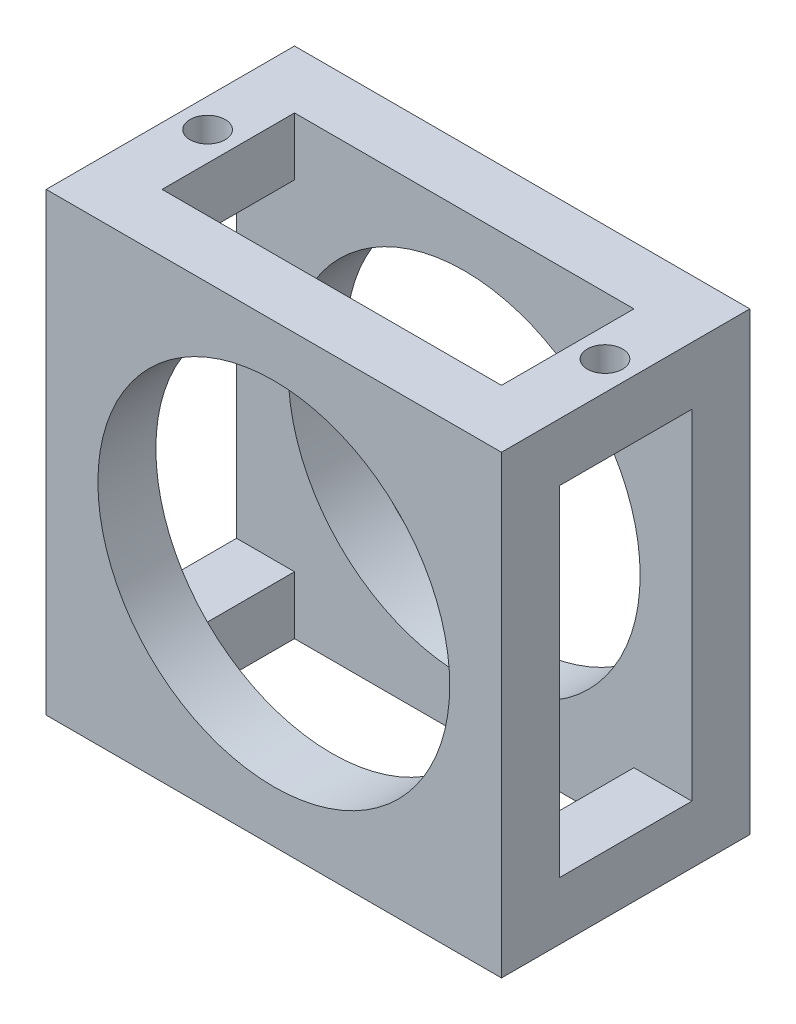
ISO-10303-21;
HEADER;
FILE_DESCRIPTION(('STEP AP214'),'2;1');
FILE_NAME('part.step','',(''),(''),'','','');
FILE_SCHEMA(('AUTOMOTIVE_DESIGN { 1 0 10303 214 1 1 1 1 }'));
ENDSEC;
DATA;
#1=APPLICATION_CONTEXT('core data for automotive mechanical design processes');
#2=APPLICATION_PROTOCOL_DEFINITION('international standard','automotive_design',2000,#1);
#3=PRODUCT_CONTEXT('',#1,'mechanical');
#4=PRODUCT('Part','Part','',(#3));
#5=PRODUCT_RELATED_PRODUCT_CATEGORY('part','',(#4));
#6=PRODUCT_DEFINITION_FORMATION('','',#4);
#7=PRODUCT_DEFINITION_CONTEXT('part definition',#1,'design');
#8=PRODUCT_DEFINITION('design','',#6,#7);
#9=PRODUCT_DEFINITION_SHAPE('','',#8);
#10=(LENGTH_UNIT() NAMED_UNIT(*) SI_UNIT(.MILLI.,.METRE.));
#11=(NAMED_UNIT(*) PLANE_ANGLE_UNIT() SI_UNIT($,.RADIAN.));
#12=(NAMED_UNIT(*) SI_UNIT($,.STERADIAN.) SOLID_ANGLE_UNIT());
#13=UNCERTAINTY_MEASURE_WITH_UNIT(LENGTH_MEASURE(1.E-05),#10,'distance_accuracy_value','');
#14=(GEOMETRIC_REPRESENTATION_CONTEXT(3) GLOBAL_UNCERTAINTY_ASSIGNED_CONTEXT((#13)) GLOBAL_UNIT_ASSIGNED_CONTEXT((#10,
#11,#12)) REPRESENTATION_CONTEXT('',''));
#15=CARTESIAN_POINT('',(0.,0.,0.));
#16=DIRECTION('',(0.,0.,1.));
#17=DIRECTION('',(1.,0.,0.));
#18=AXIS2_PLACEMENT_3D('',#15,#16,#17);
#19=CARTESIAN_POINT('',(0.,0.,0.));
#20=DIRECTION('',(0.,0.,1.));
#21=DIRECTION('',(1.,0.,0.));
#22=AXIS2_PLACEMENT_3D('',#19,#20,#21);
#23=CYLINDRICAL_SURFACE('',#22,21.25);
#24=CARTESIAN_POINT('',(0.,0.,30.));
#25=DIRECTION('',(0.,0.,1.));
#26=DIRECTION('',(1.,0.,0.));
#27=AXIS2_PLACEMENT_3D('',#24,#25,#26);
#28=CIRCLE('',#27,21.25);
#29=CARTESIAN_POINT('',(21.25,0.,30.));
#30=VERTEX_POINT('',#29);
#31=EDGE_CURVE('E278',#30,#30,#28,.T.);
#32=ORIENTED_EDGE('',*,*,#31,.T.);
#33=EDGE_LOOP('',(#32));
#34=FACE_BOUND('',#33,.T.);
#35=CARTESIAN_POINT('',(0.,0.,23.));
#36=DIRECTION('',(0.,0.,1.));
#37=DIRECTION('',(1.,0.,0.));
#38=AXIS2_PLACEMENT_3D('',#35,#36,#37);
#39=CIRCLE('',#38,21.25);
#40=CARTESIAN_POINT('',(21.25,0.,23.));
#41=VERTEX_POINT('',#40);
#42=EDGE_CURVE('E328',#41,#41,#39,.F.);
#43=ORIENTED_EDGE('',*,*,#42,.T.);
#44=EDGE_LOOP('',(#43));
#45=FACE_BOUND('',#44,.T.);
#46=ADVANCED_FACE('F45',(#34,#45),#23,.F.);
#47=CARTESIAN_POINT('',(-27.5,27.5,30.));
#48=DIRECTION('',(1.,0.,0.));
#49=DIRECTION('',(0.,1.,0.));
#50=AXIS2_PLACEMENT_3D('',#47,#48,#49);
#51=PLANE('',#50);
#52=DIRECTION('',(0.,0.,1.));
#53=VECTOR('',#52,1.);
#54=CARTESIAN_POINT('',(-27.5,20.5,30.));
#55=LINE('',#54,#53);
#56=CARTESIAN_POINT('',(-27.5,20.5,7.));
#57=VERTEX_POINT('',#56);
#58=CARTESIAN_POINT('',(-27.5,20.5,23.));
#59=VERTEX_POINT('',#58);
#60=EDGE_CURVE('E227',#57,#59,#55,.T.);
#61=ORIENTED_EDGE('',*,*,#60,.T.);
#62=DIRECTION('',(0.,-1.,0.));
#63=VECTOR('',#62,1.);
#64=CARTESIAN_POINT('',(-27.5,27.5,23.));
#65=LINE('',#64,#63);
#66=CARTESIAN_POINT('',(-27.5,-20.5,23.));
#67=VERTEX_POINT('',#66);
#68=EDGE_CURVE('E219',#59,#67,#65,.T.);
#69=ORIENTED_EDGE('',*,*,#68,.T.);
#70=DIRECTION('',(0.,0.,-1.));
#71=VECTOR('',#70,1.);
#72=CARTESIAN_POINT('',(-27.5,-20.5,30.));
#73=LINE('',#72,#71);
#74=CARTESIAN_POINT('',(-27.5,-20.5,7.));
#75=VERTEX_POINT('',#74);
#76=EDGE_CURVE('E211',#67,#75,#73,.T.);
#77=ORIENTED_EDGE('',*,*,#76,.T.);
#78=DIRECTION('',(0.,1.,0.));
#79=VECTOR('',#78,1.);
#80=CARTESIAN_POINT('',(-27.5,27.5,7.));
#81=LINE('',#80,#79);
#82=EDGE_CURVE('E215',#75,#57,#81,.T.);
#83=ORIENTED_EDGE('',*,*,#82,.T.);
#84=EDGE_LOOP('',(#61,#69,#77,#83));
#85=FACE_BOUND('',#84,.T.);
#86=DIRECTION('',(0.,-1.,0.));
#87=VECTOR('',#86,1.);
#88=CARTESIAN_POINT('',(-27.5,27.5,0.));
#89=LINE('',#88,#87);
#90=CARTESIAN_POINT('',(-27.5,27.5,0.));
#91=VERTEX_POINT('',#90);
#92=CARTESIAN_POINT('',(-27.5,-27.5,0.));
#93=VERTEX_POINT('',#92);
#94=EDGE_CURVE('E283',#91,#93,#89,.T.);
#95=ORIENTED_EDGE('',*,*,#94,.T.);
#96=DIRECTION('',(0.,0.,-1.));
#97=VECTOR('',#96,1.);
#98=CARTESIAN_POINT('',(-27.5,-27.5,30.));
#99=LINE('',#98,#97);
#100=CARTESIAN_POINT('',(-27.5,-27.5,30.));
#101=VERTEX_POINT('',#100);
#102=EDGE_CURVE('E324',#101,#93,#99,.T.);
#103=ORIENTED_EDGE('',*,*,#102,.F.);
#104=DIRECTION('',(0.,-1.,0.));
#105=VECTOR('',#104,1.);
#106=CARTESIAN_POINT('',(-27.5,27.5,30.));
#107=LINE('',#106,#105);
#108=CARTESIAN_POINT('',(-27.5,27.5,30.));
#109=VERTEX_POINT('',#108);
#110=EDGE_CURVE('E287',#109,#101,#107,.T.);
#111=ORIENTED_EDGE('',*,*,#110,.F.);
#112=DIRECTION('',(0.,0.,-1.));
#113=VECTOR('',#112,1.);
#114=CARTESIAN_POINT('',(-27.5,27.5,30.));
#115=LINE('',#114,#113);
#116=EDGE_CURVE('E301',#109,#91,#115,.T.);
#117=ORIENTED_EDGE('',*,*,#116,.T.);
#118=EDGE_LOOP('',(#95,#103,#111,#117));
#119=FACE_BOUND('',#118,.T.);
#120=ADVANCED_FACE('F47',(#85,#119),#51,.F.);
#121=CARTESIAN_POINT('',(-27.5,-27.5,30.));
#122=DIRECTION('',(0.,1.,0.));
#123=DIRECTION('',(0.,0.,1.));
#124=AXIS2_PLACEMENT_3D('',#121,#122,#123);
#125=PLANE('',#124);
#126=DIRECTION('',(-1.,0.,0.));
#127=VECTOR('',#126,1.);
#128=CARTESIAN_POINT('',(-27.5,-27.5,7.));
#129=LINE('',#128,#127);
#130=CARTESIAN_POINT('',(20.5,-27.5,7.));
#131=VERTEX_POINT('',#130);
#132=CARTESIAN_POINT('',(-20.5,-27.5,7.));
#133=VERTEX_POINT('',#132);
#134=EDGE_CURVE('E270',#131,#133,#129,.T.);
#135=ORIENTED_EDGE('',*,*,#134,.T.);
#136=DIRECTION('',(0.,0.,1.));
#137=VECTOR('',#136,1.);
#138=CARTESIAN_POINT('',(-20.5,-27.5,30.));
#139=LINE('',#138,#137);
#140=CARTESIAN_POINT('',(-20.5,-27.5,23.));
#141=VERTEX_POINT('',#140);
#142=EDGE_CURVE('E274',#133,#141,#139,.T.);
#143=ORIENTED_EDGE('',*,*,#142,.T.);
#144=DIRECTION('',(1.,0.,0.));
#145=VECTOR('',#144,1.);
#146=CARTESIAN_POINT('',(-27.5,-27.5,23.));
#147=LINE('',#146,#145);
#148=CARTESIAN_POINT('',(20.5,-27.5,23.));
#149=VERTEX_POINT('',#148);
#150=EDGE_CURVE('E262',#141,#149,#147,.T.);
#151=ORIENTED_EDGE('',*,*,#150,.T.);
#152=DIRECTION('',(0.,0.,-1.));
#153=VECTOR('',#152,1.);
#154=CARTESIAN_POINT('',(20.5,-27.5,30.));
#155=LINE('',#154,#153);
#156=EDGE_CURVE('E266',#149,#131,#155,.T.);
#157=ORIENTED_EDGE('',*,*,#156,.T.);
#158=EDGE_LOOP('',(#135,#143,#151,#157));
#159=FACE_BOUND('',#158,.T.);
#160=DIRECTION('',(1.,0.,0.));
#161=VECTOR('',#160,1.);
#162=CARTESIAN_POINT('',(-27.5,-27.5,0.));
#163=LINE('',#162,#161);
#164=CARTESIAN_POINT('',(27.5,-27.5,0.));
#165=VERTEX_POINT('',#164);
#166=EDGE_CURVE('E305',#93,#165,#163,.T.);
#167=ORIENTED_EDGE('',*,*,#166,.T.);
#168=DIRECTION('',(0.,0.,-1.));
#169=VECTOR('',#168,1.);
#170=CARTESIAN_POINT('',(27.5,-27.5,30.));
#171=LINE('',#170,#169);
#172=CARTESIAN_POINT('',(27.5,-27.5,30.));
#173=VERTEX_POINT('',#172);
#174=EDGE_CURVE('E320',#173,#165,#171,.T.);
#175=ORIENTED_EDGE('',*,*,#174,.F.);
#176=DIRECTION('',(1.,0.,0.));
#177=VECTOR('',#176,1.);
#178=CARTESIAN_POINT('',(-27.5,-27.5,30.));
#179=LINE('',#178,#177);
#180=EDGE_CURVE('E291',#101,#173,#179,.T.);
#181=ORIENTED_EDGE('',*,*,#180,.F.);
#182=ORIENTED_EDGE('',*,*,#102,.T.);
#183=EDGE_LOOP('',(#167,#175,#181,#182));
#184=FACE_BOUND('',#183,.T.);
#185=ADVANCED_FACE('F380',(#159,#184),#125,.F.);
#186=CARTESIAN_POINT('',(27.5,27.5,30.));
#187=DIRECTION('',(-1.,0.,0.));
#188=DIRECTION('',(0.,-1.,0.));
#189=AXIS2_PLACEMENT_3D('',#186,#187,#188);
#190=PLANE('',#189);
#191=DIRECTION('',(0.,0.,-1.));
#192=VECTOR('',#191,1.);
#193=CARTESIAN_POINT('',(27.5,-20.5,23.));
#194=LINE('',#193,#192);
#195=CARTESIAN_POINT('',(27.5,-20.5,23.));
#196=VERTEX_POINT('',#195);
#197=CARTESIAN_POINT('',(27.5,-20.5,6.99999999999999));
#198=VERTEX_POINT('',#197);
#199=EDGE_CURVE('E178',#196,#198,#194,.T.);
#200=ORIENTED_EDGE('',*,*,#199,.F.);
#201=DIRECTION('',(0.,-1.,0.));
#202=VECTOR('',#201,1.);
#203=CARTESIAN_POINT('',(27.5,20.5,23.));
#204=LINE('',#203,#202);
#205=CARTESIAN_POINT('',(27.5,20.5,23.));
#206=VERTEX_POINT('',#205);
#207=EDGE_CURVE('E71',#206,#196,#204,.T.);
#208=ORIENTED_EDGE('',*,*,#207,.F.);
#209=DIRECTION('',(0.,0.,1.));
#210=VECTOR('',#209,1.);
#211=CARTESIAN_POINT('',(27.5,20.5,23.));
#212=LINE('',#211,#210);
#213=CARTESIAN_POINT('',(27.5,20.5,7.));
#214=VERTEX_POINT('',#213);
#215=EDGE_CURVE('E187',#214,#206,#212,.T.);
#216=ORIENTED_EDGE('',*,*,#215,.F.);
#217=DIRECTION('',(0.,1.,0.));
#218=VECTOR('',#217,1.);
#219=CARTESIAN_POINT('',(27.5,20.5,7.));
#220=LINE('',#219,#218);
#221=EDGE_CURVE('E168',#198,#214,#220,.T.);
#222=ORIENTED_EDGE('',*,*,#221,.F.);
#223=EDGE_LOOP('',(#200,#208,#216,#222));
#224=FACE_BOUND('',#223,.T.);
#225=DIRECTION('',(0.,1.,0.));
#226=VECTOR('',#225,1.);
#227=CARTESIAN_POINT('',(27.5,27.5,0.));
#228=LINE('',#227,#226);
#229=CARTESIAN_POINT('',(27.5,27.5,0.));
#230=VERTEX_POINT('',#229);
#231=EDGE_CURVE('E308',#165,#230,#228,.T.);
#232=ORIENTED_EDGE('',*,*,#231,.T.);
#233=DIRECTION('',(0.,0.,-1.));
#234=VECTOR('',#233,1.);
#235=CARTESIAN_POINT('',(27.5,27.5,30.));
#236=LINE('',#235,#234);
#237=CARTESIAN_POINT('',(27.5,27.5,30.));
#238=VERTEX_POINT('',#237);
#239=EDGE_CURVE('E316',#238,#230,#236,.T.);
#240=ORIENTED_EDGE('',*,*,#239,.F.);
#241=DIRECTION('',(0.,1.,0.));
#242=VECTOR('',#241,1.);
#243=CARTESIAN_POINT('',(27.5,27.5,30.));
#244=LINE('',#243,#242);
#245=EDGE_CURVE('E295',#173,#238,#244,.T.);
#246=ORIENTED_EDGE('',*,*,#245,.F.);
#247=ORIENTED_EDGE('',*,*,#174,.T.);
#248=EDGE_LOOP('',(#232,#240,#246,#247));
#249=FACE_BOUND('',#248,.T.);
#250=ADVANCED_FACE('F184',(#224,#249),#190,.F.);
#251=CARTESIAN_POINT('',(-27.5,27.5,30.));
#252=DIRECTION('',(0.,-1.,0.));
#253=DIRECTION('',(0.,0.,-1.));
#254=AXIS2_PLACEMENT_3D('',#251,#252,#253);
#255=PLANE('',#254);
#256=CARTESIAN_POINT('',(-24.,27.5,14.));
#257=DIRECTION('',(0.,1.,0.));
#258=DIRECTION('',(0.,0.,1.));
#259=AXIS2_PLACEMENT_3D('',#256,#257,#258);
#260=CIRCLE('',#259,2.125);
#261=CARTESIAN_POINT('',(-24.,27.5,16.125));
#262=VERTEX_POINT('',#261);
#263=EDGE_CURVE('E337',#262,#262,#260,.T.);
#264=ORIENTED_EDGE('',*,*,#263,.F.);
#265=EDGE_LOOP('',(#264));
#266=FACE_BOUND('',#265,.T.);
#267=CARTESIAN_POINT('',(24.,27.5,14.));
#268=DIRECTION('',(0.,1.,0.));
#269=DIRECTION('',(0.,0.,1.));
#270=AXIS2_PLACEMENT_3D('',#267,#268,#269);
#271=CIRCLE('',#270,2.125);
#272=CARTESIAN_POINT('',(24.,27.5,16.125));
#273=VERTEX_POINT('',#272);
#274=EDGE_CURVE('E344',#273,#273,#271,.T.);
#275=ORIENTED_EDGE('',*,*,#274,.F.);
#276=EDGE_LOOP('',(#275));
#277=FACE_BOUND('',#276,.T.);
#278=DIRECTION('',(1.,0.,0.));
#279=VECTOR('',#278,1.);
#280=CARTESIAN_POINT('',(-20.5,27.5,23.));
#281=LINE('',#280,#279);
#282=CARTESIAN_POINT('',(-20.5,27.5,23.));
#283=VERTEX_POINT('',#282);
#284=CARTESIAN_POINT('',(20.5,27.5,23.));
#285=VERTEX_POINT('',#284);
#286=EDGE_CURVE('E235',#283,#285,#281,.T.);
#287=ORIENTED_EDGE('',*,*,#286,.F.);
#288=DIRECTION('',(0.,0.,1.));
#289=VECTOR('',#288,1.);
#290=CARTESIAN_POINT('',(-20.5,27.5,7.));
#291=LINE('',#290,#289);
#292=CARTESIAN_POINT('',(-20.5,27.5,7.));
#293=VERTEX_POINT('',#292);
#294=EDGE_CURVE('E231',#293,#283,#291,.T.);
#295=ORIENTED_EDGE('',*,*,#294,.F.);
#296=DIRECTION('',(-1.,0.,0.));
#297=VECTOR('',#296,1.);
#298=CARTESIAN_POINT('',(-20.5,27.5,7.));
#299=LINE('',#298,#297);
#300=CARTESIAN_POINT('',(20.5,27.5,7.));
#301=VERTEX_POINT('',#300);
#302=EDGE_CURVE('E243',#301,#293,#299,.T.);
#303=ORIENTED_EDGE('',*,*,#302,.F.);
#304=DIRECTION('',(0.,0.,-1.));
#305=VECTOR('',#304,1.);
#306=CARTESIAN_POINT('',(20.5,27.5,7.));
#307=LINE('',#306,#305);
#308=EDGE_CURVE('E239',#285,#301,#307,.T.);
#309=ORIENTED_EDGE('',*,*,#308,.F.);
#310=EDGE_LOOP('',(#287,#295,#303,#309));
#311=FACE_BOUND('',#310,.T.);
#312=DIRECTION('',(-1.,0.,0.));
#313=VECTOR('',#312,1.);
#314=CARTESIAN_POINT('',(-27.5,27.5,0.));
#315=LINE('',#314,#313);
#316=EDGE_CURVE('E292',#230,#91,#315,.T.);
#317=ORIENTED_EDGE('',*,*,#316,.T.);
#318=ORIENTED_EDGE('',*,*,#116,.F.);
#319=DIRECTION('',(-1.,0.,0.));
#320=VECTOR('',#319,1.);
#321=CARTESIAN_POINT('',(-27.5,27.5,30.));
#322=LINE('',#321,#320);
#323=EDGE_CURVE('E298',#238,#109,#322,.T.);
#324=ORIENTED_EDGE('',*,*,#323,.F.);
#325=ORIENTED_EDGE('',*,*,#239,.T.);
#326=EDGE_LOOP('',(#317,#318,#324,#325));
#327=FACE_BOUND('',#326,.T.);
#328=ADVANCED_FACE('F357',(#266,#277,#311,#327),#255,.F.);
#329=CARTESIAN_POINT('',(0.,0.,30.));
#330=DIRECTION('',(0.,0.,1.));
#331=DIRECTION('',(1.,0.,0.));
#332=AXIS2_PLACEMENT_3D('',#329,#330,#331);
#333=PLANE('',#332);
#334=ORIENTED_EDGE('',*,*,#31,.F.);
#335=EDGE_LOOP('',(#334));
#336=FACE_BOUND('',#335,.T.);
#337=ORIENTED_EDGE('',*,*,#110,.T.);
#338=ORIENTED_EDGE('',*,*,#180,.T.);
#339=ORIENTED_EDGE('',*,*,#245,.T.);
#340=ORIENTED_EDGE('',*,*,#323,.T.);
#341=EDGE_LOOP('',(#337,#338,#339,#340));
#342=FACE_BOUND('',#341,.T.);
#343=ADVANCED_FACE('F360',(#336,#342),#333,.T.);
#344=CARTESIAN_POINT('',(0.,0.,0.));
#345=DIRECTION('',(0.,0.,1.));
#346=DIRECTION('',(1.,0.,0.));
#347=AXIS2_PLACEMENT_3D('',#344,#345,#346);
#348=PLANE('',#347);
#349=CARTESIAN_POINT('',(0.,0.,0.));
#350=DIRECTION('',(0.,0.,1.));
#351=DIRECTION('',(1.,0.,0.));
#352=AXIS2_PLACEMENT_3D('',#349,#350,#351);
#353=CIRCLE('',#352,21.25);
#354=CARTESIAN_POINT('',(21.25,0.,0.));
#355=VERTEX_POINT('',#354);
#356=EDGE_CURVE('E279',#355,#355,#353,.T.);
#357=ORIENTED_EDGE('',*,*,#356,.T.);
#358=EDGE_LOOP('',(#357));
#359=FACE_BOUND('',#358,.T.);
#360=ORIENTED_EDGE('',*,*,#94,.F.);
#361=ORIENTED_EDGE('',*,*,#316,.F.);
#362=ORIENTED_EDGE('',*,*,#231,.F.);
#363=ORIENTED_EDGE('',*,*,#166,.F.);
#364=EDGE_LOOP('',(#360,#361,#362,#363));
#365=FACE_BOUND('',#364,.T.);
#366=ADVANCED_FACE('F377',(#359,#365),#348,.F.);
#367=CARTESIAN_POINT('',(0.,0.,7.));
#368=DIRECTION('',(0.,0.,-1.));
#369=DIRECTION('',(-1.,0.,0.));
#370=AXIS2_PLACEMENT_3D('',#367,#368,#369);
#371=CIRCLE('',#370,21.25);
#372=CARTESIAN_POINT('',(-21.25,0.,7.));
#373=VERTEX_POINT('',#372);
#374=EDGE_CURVE('E55',#373,#373,#371,.F.);
#375=ORIENTED_EDGE('',*,*,#374,.T.);
#376=EDGE_LOOP('',(#375));
#377=FACE_BOUND('',#376,.T.);
#378=ORIENTED_EDGE('',*,*,#356,.F.);
#379=EDGE_LOOP('',(#378));
#380=FACE_BOUND('',#379,.T.);
#381=ADVANCED_FACE('F394',(#377,#380),#23,.F.);
#382=CARTESIAN_POINT('',(20.5,-32.5,7.));
#383=DIRECTION('',(1.,0.,0.));
#384=DIRECTION('',(0.,0.,-1.));
#385=AXIS2_PLACEMENT_3D('',#382,#383,#384);
#386=PLANE('',#385);
#387=DIRECTION('',(0.,1.,0.));
#388=VECTOR('',#387,1.);
#389=CARTESIAN_POINT('',(20.5,-32.5,7.));
#390=LINE('',#389,#388);
#391=CARTESIAN_POINT('',(20.5,20.5,7.));
#392=VERTEX_POINT('',#391);
#393=EDGE_CURVE('E252',#392,#301,#390,.T.);
#394=ORIENTED_EDGE('',*,*,#393,.F.);
#395=DIRECTION('',(0.,0.,1.));
#396=VECTOR('',#395,1.);
#397=CARTESIAN_POINT('',(20.5,20.5,7.));
#398=LINE('',#397,#396);
#399=CARTESIAN_POINT('',(20.5,20.5,23.));
#400=VERTEX_POINT('',#399);
#401=EDGE_CURVE('E223',#392,#400,#398,.T.);
#402=ORIENTED_EDGE('',*,*,#401,.T.);
#403=DIRECTION('',(0.,1.,0.));
#404=VECTOR('',#403,1.);
#405=CARTESIAN_POINT('',(20.5,-32.5,23.));
#406=LINE('',#405,#404);
#407=EDGE_CURVE('E256',#400,#285,#406,.T.);
#408=ORIENTED_EDGE('',*,*,#407,.T.);
#409=ORIENTED_EDGE('',*,*,#308,.T.);
#410=EDGE_LOOP('',(#394,#402,#408,#409));
#411=FACE_BOUND('',#410,.T.);
#412=ADVANCED_FACE('F401',(#411),#386,.F.);
#413=CARTESIAN_POINT('',(-20.5,-32.5,7.));
#414=DIRECTION('',(-1.,0.,0.));
#415=DIRECTION('',(0.,0.,1.));
#416=AXIS2_PLACEMENT_3D('',#413,#414,#415);
#417=PLANE('',#416);
#418=DIRECTION('',(0.,1.,0.));
#419=VECTOR('',#418,1.);
#420=CARTESIAN_POINT('',(-20.5,-32.5,23.));
#421=LINE('',#420,#419);
#422=CARTESIAN_POINT('',(-20.5,20.5,23.));
#423=VERTEX_POINT('',#422);
#424=EDGE_CURVE('E247',#423,#283,#421,.T.);
#425=ORIENTED_EDGE('',*,*,#424,.F.);
#426=DIRECTION('',(0.,0.,-1.));
#427=VECTOR('',#426,1.);
#428=CARTESIAN_POINT('',(-20.5,20.5,7.));
#429=LINE('',#428,#427);
#430=CARTESIAN_POINT('',(-20.5,20.5,7.));
#431=VERTEX_POINT('',#430);
#432=EDGE_CURVE('E11',#423,#431,#429,.T.);
#433=ORIENTED_EDGE('',*,*,#432,.T.);
#434=DIRECTION('',(0.,1.,0.));
#435=VECTOR('',#434,1.);
#436=CARTESIAN_POINT('',(-20.5,-32.5,7.));
#437=LINE('',#436,#435);
#438=EDGE_CURVE('E248',#431,#293,#437,.T.);
#439=ORIENTED_EDGE('',*,*,#438,.T.);
#440=ORIENTED_EDGE('',*,*,#294,.T.);
#441=EDGE_LOOP('',(#425,#433,#439,#440));
#442=FACE_BOUND('',#441,.T.);
#443=ADVANCED_FACE('F406',(#442),#417,.F.);
#444=CARTESIAN_POINT('',(-20.5,-20.5,6.99999999999999));
#445=VERTEX_POINT('',#444);
#446=EDGE_CURVE('E251',#133,#445,#437,.T.);
#447=ORIENTED_EDGE('',*,*,#446,.T.);
#448=DIRECTION('',(0.,0.,1.));
#449=VECTOR('',#448,1.);
#450=CARTESIAN_POINT('',(-20.5,-20.5,7.));
#451=LINE('',#450,#449);
#452=CARTESIAN_POINT('',(-20.5,-20.5,23.));
#453=VERTEX_POINT('',#452);
#454=EDGE_CURVE('E207',#445,#453,#451,.T.);
#455=ORIENTED_EDGE('',*,*,#454,.T.);
#456=EDGE_CURVE('E259',#141,#453,#421,.T.);
#457=ORIENTED_EDGE('',*,*,#456,.F.);
#458=ORIENTED_EDGE('',*,*,#142,.F.);
#459=EDGE_LOOP('',(#447,#455,#457,#458));
#460=FACE_BOUND('',#459,.T.);
#461=ADVANCED_FACE('F417',(#460),#417,.F.);
#462=CARTESIAN_POINT('',(-20.5,-32.5,7.));
#463=DIRECTION('',(0.,0.,-1.));
#464=DIRECTION('',(-1.,0.,0.));
#465=AXIS2_PLACEMENT_3D('',#462,#463,#464);
#466=PLANE('',#465);
#467=DIRECTION('',(1.,0.,0.));
#468=VECTOR('',#467,1.);
#469=CARTESIAN_POINT('',(-32.5,20.5,7.));
#470=LINE('',#469,#468);
#471=EDGE_CURVE('E199',#392,#214,#470,.T.);
#472=ORIENTED_EDGE('',*,*,#471,.F.);
#473=ORIENTED_EDGE('',*,*,#393,.T.);
#474=ORIENTED_EDGE('',*,*,#302,.T.);
#475=ORIENTED_EDGE('',*,*,#438,.F.);
#476=EDGE_CURVE('E198',#57,#431,#470,.T.);
#477=ORIENTED_EDGE('',*,*,#476,.F.);
#478=ORIENTED_EDGE('',*,*,#82,.F.);
#479=DIRECTION('',(1.,0.,0.));
#480=VECTOR('',#479,1.);
#481=CARTESIAN_POINT('',(-32.5,-20.5,6.99999999999999));
#482=LINE('',#481,#480);
#483=EDGE_CURVE('E63',#75,#445,#482,.T.);
#484=ORIENTED_EDGE('',*,*,#483,.T.);
#485=ORIENTED_EDGE('',*,*,#446,.F.);
#486=ORIENTED_EDGE('',*,*,#134,.F.);
#487=CARTESIAN_POINT('',(20.5,-20.5,7.));
#488=VERTEX_POINT('',#487);
#489=EDGE_CURVE('E171',#131,#488,#390,.T.);
#490=ORIENTED_EDGE('',*,*,#489,.T.);
#491=EDGE_CURVE('E162',#488,#198,#482,.T.);
#492=ORIENTED_EDGE('',*,*,#491,.T.);
#493=ORIENTED_EDGE('',*,*,#221,.T.);
#494=EDGE_LOOP('',(#472,#473,#474,#475,#477,#478,#484,#485,#486,#490,#492,#493));
#495=FACE_BOUND('',#494,.T.);
#496=ORIENTED_EDGE('',*,*,#374,.F.);
#497=EDGE_LOOP('',(#496));
#498=FACE_BOUND('',#497,.T.);
#499=ADVANCED_FACE('F165',(#495,#498),#466,.F.);
#500=CARTESIAN_POINT('',(20.5,-20.5,23.));
#501=VERTEX_POINT('',#500);
#502=EDGE_CURVE('E255',#149,#501,#406,.T.);
#503=ORIENTED_EDGE('',*,*,#502,.T.);
#504=DIRECTION('',(0.,0.,-1.));
#505=VECTOR('',#504,1.);
#506=CARTESIAN_POINT('',(20.5,-20.5,7.));
#507=LINE('',#506,#505);
#508=EDGE_CURVE('E204',#501,#488,#507,.T.);
#509=ORIENTED_EDGE('',*,*,#508,.T.);
#510=ORIENTED_EDGE('',*,*,#489,.F.);
#511=ORIENTED_EDGE('',*,*,#156,.F.);
#512=EDGE_LOOP('',(#503,#509,#510,#511));
#513=FACE_BOUND('',#512,.T.);
#514=ADVANCED_FACE('F409',(#513),#386,.F.);
#515=CARTESIAN_POINT('',(-20.5,-32.5,23.));
#516=DIRECTION('',(0.,0.,1.));
#517=DIRECTION('',(1.,0.,0.));
#518=AXIS2_PLACEMENT_3D('',#515,#516,#517);
#519=PLANE('',#518);
#520=ORIENTED_EDGE('',*,*,#42,.F.);
#521=EDGE_LOOP('',(#520));
#522=FACE_BOUND('',#521,.T.);
#523=ORIENTED_EDGE('',*,*,#456,.T.);
#524=DIRECTION('',(1.,0.,0.));
#525=VECTOR('',#524,1.);
#526=CARTESIAN_POINT('',(-32.5,-20.5,23.));
#527=LINE('',#526,#525);
#528=EDGE_CURVE('E175',#67,#453,#527,.T.);
#529=ORIENTED_EDGE('',*,*,#528,.F.);
#530=ORIENTED_EDGE('',*,*,#68,.F.);
#531=DIRECTION('',(1.,0.,0.));
#532=VECTOR('',#531,1.);
#533=CARTESIAN_POINT('',(-32.5,20.5,23.));
#534=LINE('',#533,#532);
#535=EDGE_CURVE('E197',#59,#423,#534,.T.);
#536=ORIENTED_EDGE('',*,*,#535,.T.);
#537=ORIENTED_EDGE('',*,*,#424,.T.);
#538=ORIENTED_EDGE('',*,*,#286,.T.);
#539=ORIENTED_EDGE('',*,*,#407,.F.);
#540=EDGE_CURVE('E194',#400,#206,#534,.T.);
#541=ORIENTED_EDGE('',*,*,#540,.T.);
#542=ORIENTED_EDGE('',*,*,#207,.T.);
#543=EDGE_CURVE('E180',#501,#196,#527,.T.);
#544=ORIENTED_EDGE('',*,*,#543,.F.);
#545=ORIENTED_EDGE('',*,*,#502,.F.);
#546=ORIENTED_EDGE('',*,*,#150,.F.);
#547=EDGE_LOOP('',(#523,#529,#530,#536,#537,#538,#539,#541,#542,#544,#545,#546));
#548=FACE_BOUND('',#547,.T.);
#549=ADVANCED_FACE('F423',(#522,#548),#519,.F.);
#550=CARTESIAN_POINT('',(-32.5,-20.5,23.));
#551=DIRECTION('',(0.,-1.,0.));
#552=DIRECTION('',(1.,0.,0.));
#553=AXIS2_PLACEMENT_3D('',#550,#551,#552);
#554=PLANE('',#553);
#555=ORIENTED_EDGE('',*,*,#543,.T.);
#556=ORIENTED_EDGE('',*,*,#199,.T.);
#557=ORIENTED_EDGE('',*,*,#491,.F.);
#558=ORIENTED_EDGE('',*,*,#508,.F.);
#559=EDGE_LOOP('',(#555,#556,#557,#558));
#560=FACE_BOUND('',#559,.T.);
#561=ADVANCED_FACE('F179',(#560),#554,.F.);
#562=CARTESIAN_POINT('',(-32.5,20.5,23.));
#563=DIRECTION('',(0.,1.,0.));
#564=DIRECTION('',(-1.,0.,0.));
#565=AXIS2_PLACEMENT_3D('',#562,#563,#564);
#566=PLANE('',#565);
#567=CARTESIAN_POINT('',(24.,20.5,14.));
#568=DIRECTION('',(0.,1.,0.));
#569=DIRECTION('',(-1.,0.,0.));
#570=AXIS2_PLACEMENT_3D('',#567,#568,#569);
#571=CIRCLE('',#570,2.125);
#572=CARTESIAN_POINT('',(21.875,20.5,14.));
#573=VERTEX_POINT('',#572);
#574=EDGE_CURVE('E49',#573,#573,#571,.T.);
#575=ORIENTED_EDGE('',*,*,#574,.T.);
#576=EDGE_LOOP('',(#575));
#577=FACE_BOUND('',#576,.T.);
#578=ORIENTED_EDGE('',*,*,#471,.T.);
#579=ORIENTED_EDGE('',*,*,#215,.T.);
#580=ORIENTED_EDGE('',*,*,#540,.F.);
#581=ORIENTED_EDGE('',*,*,#401,.F.);
#582=EDGE_LOOP('',(#578,#579,#580,#581));
#583=FACE_BOUND('',#582,.T.);
#584=ADVANCED_FACE('F435',(#577,#583),#566,.F.);
#585=CARTESIAN_POINT('',(-24.,20.5,14.));
#586=DIRECTION('',(0.,1.,0.));
#587=DIRECTION('',(-1.,0.,0.));
#588=AXIS2_PLACEMENT_3D('',#585,#586,#587);
#589=CIRCLE('',#588,2.125);
#590=CARTESIAN_POINT('',(-26.125,20.5,14.));
#591=VERTEX_POINT('',#590);
#592=EDGE_CURVE('E334',#591,#591,#589,.T.);
#593=ORIENTED_EDGE('',*,*,#592,.T.);
#594=EDGE_LOOP('',(#593));
#595=FACE_BOUND('',#594,.T.);
#596=ORIENTED_EDGE('',*,*,#476,.T.);
#597=ORIENTED_EDGE('',*,*,#432,.F.);
#598=ORIENTED_EDGE('',*,*,#535,.F.);
#599=ORIENTED_EDGE('',*,*,#60,.F.);
#600=EDGE_LOOP('',(#596,#597,#598,#599));
#601=FACE_BOUND('',#600,.T.);
#602=ADVANCED_FACE('F458',(#595,#601),#566,.F.);
#603=ORIENTED_EDGE('',*,*,#528,.T.);
#604=ORIENTED_EDGE('',*,*,#454,.F.);
#605=ORIENTED_EDGE('',*,*,#483,.F.);
#606=ORIENTED_EDGE('',*,*,#76,.F.);
#607=EDGE_LOOP('',(#603,#604,#605,#606));
#608=FACE_BOUND('',#607,.T.);
#609=ADVANCED_FACE('F427',(#608),#554,.F.);
#610=CARTESIAN_POINT('',(-24.,17.5,14.));
#611=DIRECTION('',(0.,1.,0.));
#612=DIRECTION('',(0.,0.,1.));
#613=AXIS2_PLACEMENT_3D('',#610,#611,#612);
#614=CYLINDRICAL_SURFACE('',#613,2.125);
#615=ORIENTED_EDGE('',*,*,#263,.T.);
#616=EDGE_LOOP('',(#615));
#617=FACE_BOUND('',#616,.T.);
#618=ORIENTED_EDGE('',*,*,#592,.F.);
#619=EDGE_LOOP('',(#618));
#620=FACE_BOUND('',#619,.T.);
#621=ADVANCED_FACE('F472',(#617,#620),#614,.F.);
#622=CARTESIAN_POINT('',(24.,17.5,14.));
#623=DIRECTION('',(0.,1.,0.));
#624=DIRECTION('',(0.,0.,1.));
#625=AXIS2_PLACEMENT_3D('',#622,#623,#624);
#626=CYLINDRICAL_SURFACE('',#625,2.125);
#627=ORIENTED_EDGE('',*,*,#274,.T.);
#628=EDGE_LOOP('',(#627));
#629=FACE_BOUND('',#628,.T.);
#630=ORIENTED_EDGE('',*,*,#574,.F.);
#631=EDGE_LOOP('',(#630));
#632=FACE_BOUND('',#631,.T.);
#633=ADVANCED_FACE('F354',(#629,#632),#626,.F.);
#634=CLOSED_SHELL('',(#46,#120,#185,#250,#328,#343,#366,#381,#412,#443,#461,#499,#514,#549,#561,
#584,#602,#609,#621,#633));
#635=MANIFOLD_SOLID_BREP('B2',#634);
#636=ADVANCED_BREP_SHAPE_REPRESENTATION('',(#18,#635),#14);
#637=SHAPE_DEFINITION_REPRESENTATION(#9,#636);
ENDSEC;
END-ISO-10303-21;
